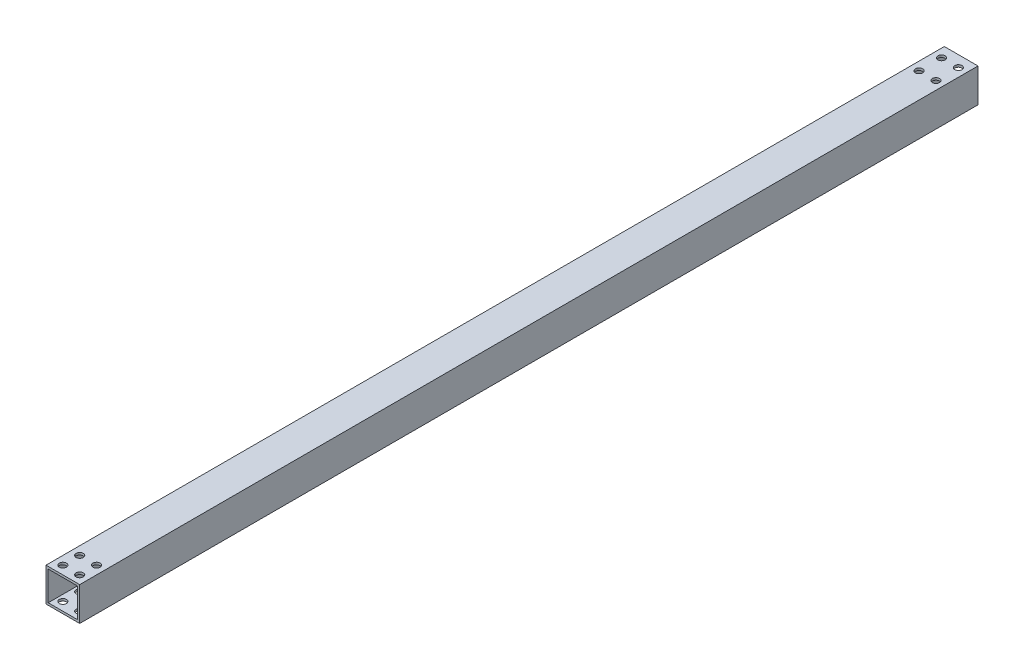
ISO-10303-21;
HEADER;
FILE_DESCRIPTION(('STEP AP214'),'2;1');
FILE_NAME('part.step','',(''),(''),'','','');
FILE_SCHEMA(('AUTOMOTIVE_DESIGN { 1 0 10303 214 1 1 1 1 }'));
ENDSEC;
DATA;
#1=APPLICATION_CONTEXT('core data for automotive mechanical design processes');
#2=APPLICATION_PROTOCOL_DEFINITION('international standard','automotive_design',2000,#1);
#3=PRODUCT_CONTEXT('',#1,'mechanical');
#4=PRODUCT('Part','Part','',(#3));
#5=PRODUCT_RELATED_PRODUCT_CATEGORY('part','',(#4));
#6=PRODUCT_DEFINITION_FORMATION('','',#4);
#7=PRODUCT_DEFINITION_CONTEXT('part definition',#1,'design');
#8=PRODUCT_DEFINITION('design','',#6,#7);
#9=PRODUCT_DEFINITION_SHAPE('','',#8);
#10=(LENGTH_UNIT() NAMED_UNIT(*) SI_UNIT(.MILLI.,.METRE.));
#11=(NAMED_UNIT(*) PLANE_ANGLE_UNIT() SI_UNIT($,.RADIAN.));
#12=(NAMED_UNIT(*) SI_UNIT($,.STERADIAN.) SOLID_ANGLE_UNIT());
#13=UNCERTAINTY_MEASURE_WITH_UNIT(LENGTH_MEASURE(1.E-05),#10,'distance_accuracy_value','');
#14=(GEOMETRIC_REPRESENTATION_CONTEXT(3) GLOBAL_UNCERTAINTY_ASSIGNED_CONTEXT((#13)) GLOBAL_UNIT_ASSIGNED_CONTEXT((#10,
#11,#12)) REPRESENTATION_CONTEXT('',''));
#15=CARTESIAN_POINT('',(0.,0.,0.));
#16=DIRECTION('',(0.,0.,1.));
#17=DIRECTION('',(1.,0.,0.));
#18=AXIS2_PLACEMENT_3D('',#15,#16,#17);
#19=CARTESIAN_POINT('',(0.,0.,400.));
#20=DIRECTION('',(0.,0.,1.));
#21=DIRECTION('',(1.,0.,0.));
#22=AXIS2_PLACEMENT_3D('',#19,#20,#21);
#23=PLANE('',#22);
#24=DIRECTION('',(0.,-1.,0.));
#25=VECTOR('',#24,1.);
#26=CARTESIAN_POINT('',(0.,0.,400.));
#27=LINE('',#26,#25);
#28=CARTESIAN_POINT('',(0.,0.,400.));
#29=VERTEX_POINT('',#28);
#30=CARTESIAN_POINT('',(0.,-15.,400.));
#31=VERTEX_POINT('',#30);
#32=EDGE_CURVE('E185',#29,#31,#27,.T.);
#33=ORIENTED_EDGE('',*,*,#32,.T.);
#34=DIRECTION('',(1.,0.,0.));
#35=VECTOR('',#34,1.);
#36=CARTESIAN_POINT('',(0.,-15.,400.));
#37=LINE('',#36,#35);
#38=CARTESIAN_POINT('',(15.,-15.,400.));
#39=VERTEX_POINT('',#38);
#40=EDGE_CURVE('E189',#31,#39,#37,.T.);
#41=ORIENTED_EDGE('',*,*,#40,.T.);
#42=DIRECTION('',(0.,1.,0.));
#43=VECTOR('',#42,1.);
#44=CARTESIAN_POINT('',(15.,0.,400.));
#45=LINE('',#44,#43);
#46=CARTESIAN_POINT('',(15.,0.,400.));
#47=VERTEX_POINT('',#46);
#48=EDGE_CURVE('E193',#39,#47,#45,.T.);
#49=ORIENTED_EDGE('',*,*,#48,.T.);
#50=DIRECTION('',(-1.,0.,0.));
#51=VECTOR('',#50,1.);
#52=CARTESIAN_POINT('',(0.,0.,400.));
#53=LINE('',#52,#51);
#54=EDGE_CURVE('E196',#47,#29,#53,.T.);
#55=ORIENTED_EDGE('',*,*,#54,.T.);
#56=EDGE_LOOP('',(#33,#41,#49,#55));
#57=FACE_BOUND('',#56,.T.);
#58=DIRECTION('',(1.,0.,0.));
#59=VECTOR('',#58,1.);
#60=CARTESIAN_POINT('',(0.,-14.,400.));
#61=LINE('',#60,#59);
#62=CARTESIAN_POINT('',(1.,-14.,400.));
#63=VERTEX_POINT('',#62);
#64=CARTESIAN_POINT('',(14.,-14.,400.));
#65=VERTEX_POINT('',#64);
#66=EDGE_CURVE('E144',#63,#65,#61,.T.);
#67=ORIENTED_EDGE('',*,*,#66,.F.);
#68=DIRECTION('',(0.,-1.,0.));
#69=VECTOR('',#68,1.);
#70=CARTESIAN_POINT('',(1.,0.,400.));
#71=LINE('',#70,#69);
#72=CARTESIAN_POINT('',(1.,-1.,400.));
#73=VERTEX_POINT('',#72);
#74=EDGE_CURVE('E135',#73,#63,#71,.T.);
#75=ORIENTED_EDGE('',*,*,#74,.F.);
#76=DIRECTION('',(-1.,0.,0.));
#77=VECTOR('',#76,1.);
#78=CARTESIAN_POINT('',(0.,-1.,400.));
#79=LINE('',#78,#77);
#80=CARTESIAN_POINT('',(14.,-1.,400.));
#81=VERTEX_POINT('',#80);
#82=EDGE_CURVE('E161',#81,#73,#79,.T.);
#83=ORIENTED_EDGE('',*,*,#82,.F.);
#84=DIRECTION('',(0.,1.,0.));
#85=VECTOR('',#84,1.);
#86=CARTESIAN_POINT('',(14.,0.,400.));
#87=LINE('',#86,#85);
#88=EDGE_CURVE('E157',#65,#81,#87,.T.);
#89=ORIENTED_EDGE('',*,*,#88,.F.);
#90=EDGE_LOOP('',(#67,#75,#83,#89));
#91=FACE_BOUND('',#90,.T.);
#92=ADVANCED_FACE('F67',(#57,#91),#23,.T.);
#93=CARTESIAN_POINT('',(0.,0.,0.));
#94=DIRECTION('',(0.,0.,1.));
#95=DIRECTION('',(1.,0.,0.));
#96=AXIS2_PLACEMENT_3D('',#93,#94,#95);
#97=PLANE('',#96);
#98=DIRECTION('',(0.,-1.,0.));
#99=VECTOR('',#98,1.);
#100=CARTESIAN_POINT('',(0.,0.,0.));
#101=LINE('',#100,#99);
#102=CARTESIAN_POINT('',(0.,0.,0.));
#103=VERTEX_POINT('',#102);
#104=CARTESIAN_POINT('',(0.,-15.,0.));
#105=VERTEX_POINT('',#104);
#106=EDGE_CURVE('E153',#103,#105,#101,.T.);
#107=ORIENTED_EDGE('',*,*,#106,.F.);
#108=DIRECTION('',(-1.,0.,0.));
#109=VECTOR('',#108,1.);
#110=CARTESIAN_POINT('',(0.,0.,0.));
#111=LINE('',#110,#109);
#112=CARTESIAN_POINT('',(15.,0.,0.));
#113=VERTEX_POINT('',#112);
#114=EDGE_CURVE('E190',#113,#103,#111,.T.);
#115=ORIENTED_EDGE('',*,*,#114,.F.);
#116=DIRECTION('',(0.,1.,0.));
#117=VECTOR('',#116,1.);
#118=CARTESIAN_POINT('',(15.,0.,0.));
#119=LINE('',#118,#117);
#120=CARTESIAN_POINT('',(15.,-15.,0.));
#121=VERTEX_POINT('',#120);
#122=EDGE_CURVE('E206',#121,#113,#119,.T.);
#123=ORIENTED_EDGE('',*,*,#122,.F.);
#124=DIRECTION('',(1.,0.,0.));
#125=VECTOR('',#124,1.);
#126=CARTESIAN_POINT('',(0.,-15.,0.));
#127=LINE('',#126,#125);
#128=EDGE_CURVE('E203',#105,#121,#127,.T.);
#129=ORIENTED_EDGE('',*,*,#128,.F.);
#130=EDGE_LOOP('',(#107,#115,#123,#129));
#131=FACE_BOUND('',#130,.T.);
#132=DIRECTION('',(0.,-1.,0.));
#133=VECTOR('',#132,1.);
#134=CARTESIAN_POINT('',(1.,0.,0.));
#135=LINE('',#134,#133);
#136=CARTESIAN_POINT('',(1.,-1.,0.));
#137=VERTEX_POINT('',#136);
#138=CARTESIAN_POINT('',(1.,-14.,0.));
#139=VERTEX_POINT('',#138);
#140=EDGE_CURVE('E93',#137,#139,#135,.T.);
#141=ORIENTED_EDGE('',*,*,#140,.T.);
#142=DIRECTION('',(1.,0.,0.));
#143=VECTOR('',#142,1.);
#144=CARTESIAN_POINT('',(0.,-14.,0.));
#145=LINE('',#144,#143);
#146=CARTESIAN_POINT('',(14.,-14.,0.));
#147=VERTEX_POINT('',#146);
#148=EDGE_CURVE('E151',#139,#147,#145,.T.);
#149=ORIENTED_EDGE('',*,*,#148,.T.);
#150=DIRECTION('',(0.,1.,0.));
#151=VECTOR('',#150,1.);
#152=CARTESIAN_POINT('',(14.,0.,0.));
#153=LINE('',#152,#151);
#154=CARTESIAN_POINT('',(14.,-1.,0.));
#155=VERTEX_POINT('',#154);
#156=EDGE_CURVE('E172',#147,#155,#153,.T.);
#157=ORIENTED_EDGE('',*,*,#156,.T.);
#158=DIRECTION('',(-1.,0.,0.));
#159=VECTOR('',#158,1.);
#160=CARTESIAN_POINT('',(0.,-1.,0.));
#161=LINE('',#160,#159);
#162=EDGE_CURVE('E145',#155,#137,#161,.T.);
#163=ORIENTED_EDGE('',*,*,#162,.T.);
#164=EDGE_LOOP('',(#141,#149,#157,#163));
#165=FACE_BOUND('',#164,.T.);
#166=ADVANCED_FACE('F298',(#131,#165),#97,.F.);
#167=CARTESIAN_POINT('',(0.,0.,400.));
#168=DIRECTION('',(1.,0.,0.));
#169=DIRECTION('',(0.,1.,0.));
#170=AXIS2_PLACEMENT_3D('',#167,#168,#169);
#171=PLANE('',#170);
#172=ORIENTED_EDGE('',*,*,#106,.T.);
#173=DIRECTION('',(0.,0.,-1.));
#174=VECTOR('',#173,1.);
#175=CARTESIAN_POINT('',(0.,-15.,400.));
#176=LINE('',#175,#174);
#177=EDGE_CURVE('E12',#31,#105,#176,.T.);
#178=ORIENTED_EDGE('',*,*,#177,.F.);
#179=ORIENTED_EDGE('',*,*,#32,.F.);
#180=DIRECTION('',(0.,0.,-1.));
#181=VECTOR('',#180,1.);
#182=CARTESIAN_POINT('',(0.,0.,400.));
#183=LINE('',#182,#181);
#184=EDGE_CURVE('E199',#29,#103,#183,.T.);
#185=ORIENTED_EDGE('',*,*,#184,.T.);
#186=EDGE_LOOP('',(#172,#178,#179,#185));
#187=FACE_BOUND('',#186,.T.);
#188=ADVANCED_FACE('F69',(#187),#171,.F.);
#189=CARTESIAN_POINT('',(0.,-15.,400.));
#190=DIRECTION('',(0.,1.,0.));
#191=DIRECTION('',(0.,0.,1.));
#192=AXIS2_PLACEMENT_3D('',#189,#190,#191);
#193=PLANE('',#192);
#194=CARTESIAN_POINT('',(11.25,-15.,5.));
#195=DIRECTION('',(0.,1.,0.));
#196=DIRECTION('',(0.,0.,-1.));
#197=AXIS2_PLACEMENT_3D('',#194,#195,#196);
#198=CIRCLE('',#197,1.6);
#199=CARTESIAN_POINT('',(11.25,-15.,3.4));
#200=VERTEX_POINT('',#199);
#201=EDGE_CURVE('E334',#200,#200,#198,.T.);
#202=ORIENTED_EDGE('',*,*,#201,.T.);
#203=EDGE_LOOP('',(#202));
#204=FACE_BOUND('',#203,.T.);
#205=CARTESIAN_POINT('',(11.25,-15.,15.));
#206=DIRECTION('',(0.,1.,0.));
#207=DIRECTION('',(0.,0.,1.));
#208=AXIS2_PLACEMENT_3D('',#205,#206,#207);
#209=CIRCLE('',#208,1.6);
#210=CARTESIAN_POINT('',(11.25,-15.,16.6));
#211=VERTEX_POINT('',#210);
#212=EDGE_CURVE('E338',#211,#211,#209,.T.);
#213=ORIENTED_EDGE('',*,*,#212,.T.);
#214=EDGE_LOOP('',(#213));
#215=FACE_BOUND('',#214,.T.);
#216=CARTESIAN_POINT('',(3.75,-15.,15.));
#217=DIRECTION('',(0.,1.,0.));
#218=DIRECTION('',(0.,0.,-1.));
#219=AXIS2_PLACEMENT_3D('',#216,#217,#218);
#220=CIRCLE('',#219,1.6);
#221=CARTESIAN_POINT('',(3.75,-15.,13.4));
#222=VERTEX_POINT('',#221);
#223=EDGE_CURVE('E342',#222,#222,#220,.T.);
#224=ORIENTED_EDGE('',*,*,#223,.T.);
#225=EDGE_LOOP('',(#224));
#226=FACE_BOUND('',#225,.T.);
#227=CARTESIAN_POINT('',(3.75000000000005,-15.,396.25));
#228=DIRECTION('',(0.,1.,0.));
#229=DIRECTION('',(0.,0.,1.));
#230=AXIS2_PLACEMENT_3D('',#227,#228,#229);
#231=CIRCLE('',#230,1.59999999999999);
#232=CARTESIAN_POINT('',(3.75000000000005,-15.,397.85));
#233=VERTEX_POINT('',#232);
#234=EDGE_CURVE('E346',#233,#233,#231,.T.);
#235=ORIENTED_EDGE('',*,*,#234,.T.);
#236=EDGE_LOOP('',(#235));
#237=FACE_BOUND('',#236,.T.);
#238=CARTESIAN_POINT('',(11.25,-15.,396.25));
#239=DIRECTION('',(0.,1.,0.));
#240=DIRECTION('',(0.,0.,-1.));
#241=AXIS2_PLACEMENT_3D('',#238,#239,#240);
#242=CIRCLE('',#241,1.59999999999999);
#243=CARTESIAN_POINT('',(11.25,-15.,394.65));
#244=VERTEX_POINT('',#243);
#245=EDGE_CURVE('E350',#244,#244,#242,.T.);
#246=ORIENTED_EDGE('',*,*,#245,.T.);
#247=EDGE_LOOP('',(#246));
#248=FACE_BOUND('',#247,.T.);
#249=CARTESIAN_POINT('',(11.25,-15.,388.75));
#250=DIRECTION('',(0.,1.,0.));
#251=DIRECTION('',(0.,0.,1.));
#252=AXIS2_PLACEMENT_3D('',#249,#250,#251);
#253=CIRCLE('',#252,1.59999999999999);
#254=CARTESIAN_POINT('',(11.25,-15.,390.35));
#255=VERTEX_POINT('',#254);
#256=EDGE_CURVE('E354',#255,#255,#253,.T.);
#257=ORIENTED_EDGE('',*,*,#256,.T.);
#258=EDGE_LOOP('',(#257));
#259=FACE_BOUND('',#258,.T.);
#260=CARTESIAN_POINT('',(3.75000000000005,-15.,388.75));
#261=DIRECTION('',(0.,1.,0.));
#262=DIRECTION('',(0.,0.,-1.));
#263=AXIS2_PLACEMENT_3D('',#260,#261,#262);
#264=CIRCLE('',#263,1.59999999999999);
#265=CARTESIAN_POINT('',(3.75000000000005,-15.,387.15));
#266=VERTEX_POINT('',#265);
#267=EDGE_CURVE('E358',#266,#266,#264,.T.);
#268=ORIENTED_EDGE('',*,*,#267,.T.);
#269=EDGE_LOOP('',(#268));
#270=FACE_BOUND('',#269,.T.);
#271=CARTESIAN_POINT('',(3.75,-15.,5.));
#272=DIRECTION('',(0.,1.,0.));
#273=DIRECTION('',(0.,0.,1.));
#274=AXIS2_PLACEMENT_3D('',#271,#272,#273);
#275=CIRCLE('',#274,1.6);
#276=CARTESIAN_POINT('',(3.75,-15.,6.6));
#277=VERTEX_POINT('',#276);
#278=EDGE_CURVE('E226',#277,#277,#275,.T.);
#279=ORIENTED_EDGE('',*,*,#278,.T.);
#280=EDGE_LOOP('',(#279));
#281=FACE_BOUND('',#280,.T.);
#282=ORIENTED_EDGE('',*,*,#128,.T.);
#283=DIRECTION('',(0.,0.,-1.));
#284=VECTOR('',#283,1.);
#285=CARTESIAN_POINT('',(15.,-15.,400.));
#286=LINE('',#285,#284);
#287=EDGE_CURVE('E77',#39,#121,#286,.T.);
#288=ORIENTED_EDGE('',*,*,#287,.F.);
#289=ORIENTED_EDGE('',*,*,#40,.F.);
#290=ORIENTED_EDGE('',*,*,#177,.T.);
#291=EDGE_LOOP('',(#282,#288,#289,#290));
#292=FACE_BOUND('',#291,.T.);
#293=ADVANCED_FACE('F323',(#204,#215,#226,#237,#248,#259,#270,#281,#292),#193,.F.);
#294=CARTESIAN_POINT('',(15.,0.,400.));
#295=DIRECTION('',(-1.,0.,0.));
#296=DIRECTION('',(0.,-1.,0.));
#297=AXIS2_PLACEMENT_3D('',#294,#295,#296);
#298=PLANE('',#297);
#299=ORIENTED_EDGE('',*,*,#122,.T.);
#300=DIRECTION('',(0.,0.,-1.));
#301=VECTOR('',#300,1.);
#302=CARTESIAN_POINT('',(15.,0.,400.));
#303=LINE('',#302,#301);
#304=EDGE_CURVE('E214',#47,#113,#303,.T.);
#305=ORIENTED_EDGE('',*,*,#304,.F.);
#306=ORIENTED_EDGE('',*,*,#48,.F.);
#307=ORIENTED_EDGE('',*,*,#287,.T.);
#308=EDGE_LOOP('',(#299,#305,#306,#307));
#309=FACE_BOUND('',#308,.T.);
#310=ADVANCED_FACE('F320',(#309),#298,.F.);
#311=CARTESIAN_POINT('',(0.,0.,400.));
#312=DIRECTION('',(0.,-1.,0.));
#313=DIRECTION('',(0.,0.,-1.));
#314=AXIS2_PLACEMENT_3D('',#311,#312,#313);
#315=PLANE('',#314);
#316=CARTESIAN_POINT('',(11.25,0.,5.));
#317=DIRECTION('',(0.,1.,0.));
#318=DIRECTION('',(0.,0.,-1.));
#319=AXIS2_PLACEMENT_3D('',#316,#317,#318);
#320=CIRCLE('',#319,1.6);
#321=CARTESIAN_POINT('',(11.25,0.,3.4));
#322=VERTEX_POINT('',#321);
#323=EDGE_CURVE('E379',#322,#322,#320,.T.);
#324=ORIENTED_EDGE('',*,*,#323,.F.);
#325=EDGE_LOOP('',(#324));
#326=FACE_BOUND('',#325,.T.);
#327=CARTESIAN_POINT('',(11.25,0.,15.));
#328=DIRECTION('',(0.,1.,0.));
#329=DIRECTION('',(0.,0.,1.));
#330=AXIS2_PLACEMENT_3D('',#327,#328,#329);
#331=CIRCLE('',#330,1.6);
#332=CARTESIAN_POINT('',(11.25,0.,16.6));
#333=VERTEX_POINT('',#332);
#334=EDGE_CURVE('E496',#333,#333,#331,.T.);
#335=ORIENTED_EDGE('',*,*,#334,.F.);
#336=EDGE_LOOP('',(#335));
#337=FACE_BOUND('',#336,.T.);
#338=CARTESIAN_POINT('',(3.75,0.,15.));
#339=DIRECTION('',(0.,1.,0.));
#340=DIRECTION('',(0.,0.,-1.));
#341=AXIS2_PLACEMENT_3D('',#338,#339,#340);
#342=CIRCLE('',#341,1.6);
#343=CARTESIAN_POINT('',(3.75,0.,13.4));
#344=VERTEX_POINT('',#343);
#345=EDGE_CURVE('E502',#344,#344,#342,.T.);
#346=ORIENTED_EDGE('',*,*,#345,.F.);
#347=EDGE_LOOP('',(#346));
#348=FACE_BOUND('',#347,.T.);
#349=CARTESIAN_POINT('',(3.75000000000005,0.,396.25));
#350=DIRECTION('',(0.,1.,0.));
#351=DIRECTION('',(0.,0.,1.));
#352=AXIS2_PLACEMENT_3D('',#349,#350,#351);
#353=CIRCLE('',#352,1.59999999999999);
#354=CARTESIAN_POINT('',(3.75000000000005,0.,397.85));
#355=VERTEX_POINT('',#354);
#356=EDGE_CURVE('E467',#355,#355,#353,.T.);
#357=ORIENTED_EDGE('',*,*,#356,.F.);
#358=EDGE_LOOP('',(#357));
#359=FACE_BOUND('',#358,.T.);
#360=CARTESIAN_POINT('',(11.25,0.,396.25));
#361=DIRECTION('',(0.,1.,0.));
#362=DIRECTION('',(0.,0.,-1.));
#363=AXIS2_PLACEMENT_3D('',#360,#361,#362);
#364=CIRCLE('',#363,1.59999999999999);
#365=CARTESIAN_POINT('',(11.25,0.,394.65));
#366=VERTEX_POINT('',#365);
#367=EDGE_CURVE('E468',#366,#366,#364,.T.);
#368=ORIENTED_EDGE('',*,*,#367,.F.);
#369=EDGE_LOOP('',(#368));
#370=FACE_BOUND('',#369,.T.);
#371=CARTESIAN_POINT('',(11.25,0.,388.75));
#372=DIRECTION('',(0.,1.,0.));
#373=DIRECTION('',(0.,0.,1.));
#374=AXIS2_PLACEMENT_3D('',#371,#372,#373);
#375=CIRCLE('',#374,1.59999999999999);
#376=CARTESIAN_POINT('',(11.25,0.,390.35));
#377=VERTEX_POINT('',#376);
#378=EDGE_CURVE('E477',#377,#377,#375,.T.);
#379=ORIENTED_EDGE('',*,*,#378,.F.);
#380=EDGE_LOOP('',(#379));
#381=FACE_BOUND('',#380,.T.);
#382=CARTESIAN_POINT('',(3.75000000000005,0.,388.75));
#383=DIRECTION('',(0.,1.,0.));
#384=DIRECTION('',(0.,0.,-1.));
#385=AXIS2_PLACEMENT_3D('',#382,#383,#384);
#386=CIRCLE('',#385,1.59999999999999);
#387=CARTESIAN_POINT('',(3.75000000000005,0.,387.15));
#388=VERTEX_POINT('',#387);
#389=EDGE_CURVE('E485',#388,#388,#386,.T.);
#390=ORIENTED_EDGE('',*,*,#389,.F.);
#391=EDGE_LOOP('',(#390));
#392=FACE_BOUND('',#391,.T.);
#393=CARTESIAN_POINT('',(3.75,0.,5.));
#394=DIRECTION('',(0.,1.,0.));
#395=DIRECTION('',(0.,0.,1.));
#396=AXIS2_PLACEMENT_3D('',#393,#394,#395);
#397=CIRCLE('',#396,1.6);
#398=CARTESIAN_POINT('',(3.75,0.,6.6));
#399=VERTEX_POINT('',#398);
#400=EDGE_CURVE('E375',#399,#399,#397,.T.);
#401=ORIENTED_EDGE('',*,*,#400,.F.);
#402=EDGE_LOOP('',(#401));
#403=FACE_BOUND('',#402,.T.);
#404=ORIENTED_EDGE('',*,*,#114,.T.);
#405=ORIENTED_EDGE('',*,*,#184,.F.);
#406=ORIENTED_EDGE('',*,*,#54,.F.);
#407=ORIENTED_EDGE('',*,*,#304,.T.);
#408=EDGE_LOOP('',(#404,#405,#406,#407));
#409=FACE_BOUND('',#408,.T.);
#410=ADVANCED_FACE('F317',(#326,#337,#348,#359,#370,#381,#392,#403,#409),#315,.F.);
#411=CARTESIAN_POINT('',(1.,0.,400.));
#412=DIRECTION('',(1.,0.,0.));
#413=DIRECTION('',(0.,1.,0.));
#414=AXIS2_PLACEMENT_3D('',#411,#412,#413);
#415=PLANE('',#414);
#416=ORIENTED_EDGE('',*,*,#140,.F.);
#417=DIRECTION('',(0.,0.,-1.));
#418=VECTOR('',#417,1.);
#419=CARTESIAN_POINT('',(1.,-1.,400.));
#420=LINE('',#419,#418);
#421=EDGE_CURVE('E139',#73,#137,#420,.T.);
#422=ORIENTED_EDGE('',*,*,#421,.F.);
#423=ORIENTED_EDGE('',*,*,#74,.T.);
#424=DIRECTION('',(0.,0.,-1.));
#425=VECTOR('',#424,1.);
#426=CARTESIAN_POINT('',(1.,-14.,400.));
#427=LINE('',#426,#425);
#428=EDGE_CURVE('E138',#63,#139,#427,.T.);
#429=ORIENTED_EDGE('',*,*,#428,.T.);
#430=EDGE_LOOP('',(#416,#422,#423,#429));
#431=FACE_BOUND('',#430,.T.);
#432=ADVANCED_FACE('F137',(#431),#415,.T.);
#433=CARTESIAN_POINT('',(0.,-14.,400.));
#434=DIRECTION('',(0.,1.,0.));
#435=DIRECTION('',(0.,0.,1.));
#436=AXIS2_PLACEMENT_3D('',#433,#434,#435);
#437=PLANE('',#436);
#438=CARTESIAN_POINT('',(11.25,-14.,5.));
#439=DIRECTION('',(0.,1.,0.));
#440=DIRECTION('',(0.,0.,1.));
#441=AXIS2_PLACEMENT_3D('',#438,#439,#440);
#442=CIRCLE('',#441,1.6);
#443=CARTESIAN_POINT('',(11.25,-14.,6.6));
#444=VERTEX_POINT('',#443);
#445=EDGE_CURVE('E169',#444,#444,#442,.T.);
#446=ORIENTED_EDGE('',*,*,#445,.F.);
#447=EDGE_LOOP('',(#446));
#448=FACE_BOUND('',#447,.T.);
#449=CARTESIAN_POINT('',(11.25,-14.,15.));
#450=DIRECTION('',(0.,1.,0.));
#451=DIRECTION('',(0.,0.,1.));
#452=AXIS2_PLACEMENT_3D('',#449,#450,#451);
#453=CIRCLE('',#452,1.6);
#454=CARTESIAN_POINT('',(11.25,-14.,16.6));
#455=VERTEX_POINT('',#454);
#456=EDGE_CURVE('E254',#455,#455,#453,.T.);
#457=ORIENTED_EDGE('',*,*,#456,.F.);
#458=EDGE_LOOP('',(#457));
#459=FACE_BOUND('',#458,.T.);
#460=CARTESIAN_POINT('',(3.75,-14.,15.));
#461=DIRECTION('',(0.,1.,0.));
#462=DIRECTION('',(0.,0.,1.));
#463=AXIS2_PLACEMENT_3D('',#460,#461,#462);
#464=CIRCLE('',#463,1.6);
#465=CARTESIAN_POINT('',(3.75,-14.,16.6));
#466=VERTEX_POINT('',#465);
#467=EDGE_CURVE('E250',#466,#466,#464,.T.);
#468=ORIENTED_EDGE('',*,*,#467,.F.);
#469=EDGE_LOOP('',(#468));
#470=FACE_BOUND('',#469,.T.);
#471=CARTESIAN_POINT('',(3.75000000000005,-14.,396.25));
#472=DIRECTION('',(0.,1.,0.));
#473=DIRECTION('',(0.,0.,1.));
#474=AXIS2_PLACEMENT_3D('',#471,#472,#473);
#475=CIRCLE('',#474,1.59999999999999);
#476=CARTESIAN_POINT('',(3.75000000000005,-14.,397.85));
#477=VERTEX_POINT('',#476);
#478=EDGE_CURVE('E246',#477,#477,#475,.T.);
#479=ORIENTED_EDGE('',*,*,#478,.F.);
#480=EDGE_LOOP('',(#479));
#481=FACE_BOUND('',#480,.T.);
#482=CARTESIAN_POINT('',(11.25,-14.,396.25));
#483=DIRECTION('',(0.,1.,0.));
#484=DIRECTION('',(0.,0.,1.));
#485=AXIS2_PLACEMENT_3D('',#482,#483,#484);
#486=CIRCLE('',#485,1.59999999999999);
#487=CARTESIAN_POINT('',(11.25,-14.,397.85));
#488=VERTEX_POINT('',#487);
#489=EDGE_CURVE('E241',#488,#488,#486,.T.);
#490=ORIENTED_EDGE('',*,*,#489,.F.);
#491=EDGE_LOOP('',(#490));
#492=FACE_BOUND('',#491,.T.);
#493=CARTESIAN_POINT('',(11.25,-14.,388.75));
#494=DIRECTION('',(0.,1.,0.));
#495=DIRECTION('',(0.,0.,1.));
#496=AXIS2_PLACEMENT_3D('',#493,#494,#495);
#497=CIRCLE('',#496,1.59999999999999);
#498=CARTESIAN_POINT('',(11.25,-14.,390.35));
#499=VERTEX_POINT('',#498);
#500=EDGE_CURVE('E236',#499,#499,#497,.T.);
#501=ORIENTED_EDGE('',*,*,#500,.F.);
#502=EDGE_LOOP('',(#501));
#503=FACE_BOUND('',#502,.T.);
#504=CARTESIAN_POINT('',(3.75000000000005,-14.,388.75));
#505=DIRECTION('',(0.,1.,0.));
#506=DIRECTION('',(0.,0.,1.));
#507=AXIS2_PLACEMENT_3D('',#504,#505,#506);
#508=CIRCLE('',#507,1.59999999999999);
#509=CARTESIAN_POINT('',(3.75000000000005,-14.,390.35));
#510=VERTEX_POINT('',#509);
#511=EDGE_CURVE('E231',#510,#510,#508,.T.);
#512=ORIENTED_EDGE('',*,*,#511,.F.);
#513=EDGE_LOOP('',(#512));
#514=FACE_BOUND('',#513,.T.);
#515=CARTESIAN_POINT('',(3.75,-14.,5.));
#516=DIRECTION('',(0.,1.,0.));
#517=DIRECTION('',(0.,0.,1.));
#518=AXIS2_PLACEMENT_3D('',#515,#516,#517);
#519=CIRCLE('',#518,1.6);
#520=CARTESIAN_POINT('',(3.75,-14.,6.6));
#521=VERTEX_POINT('',#520);
#522=EDGE_CURVE('E225',#521,#521,#519,.T.);
#523=ORIENTED_EDGE('',*,*,#522,.F.);
#524=EDGE_LOOP('',(#523));
#525=FACE_BOUND('',#524,.T.);
#526=ORIENTED_EDGE('',*,*,#148,.F.);
#527=ORIENTED_EDGE('',*,*,#428,.F.);
#528=ORIENTED_EDGE('',*,*,#66,.T.);
#529=DIRECTION('',(0.,0.,-1.));
#530=VECTOR('',#529,1.);
#531=CARTESIAN_POINT('',(14.,-14.,400.));
#532=LINE('',#531,#530);
#533=EDGE_CURVE('E154',#65,#147,#532,.T.);
#534=ORIENTED_EDGE('',*,*,#533,.T.);
#535=EDGE_LOOP('',(#526,#527,#528,#534));
#536=FACE_BOUND('',#535,.T.);
#537=ADVANCED_FACE('F148',(#448,#459,#470,#481,#492,#503,#514,#525,#536),#437,.T.);
#538=CARTESIAN_POINT('',(14.,0.,400.));
#539=DIRECTION('',(-1.,0.,0.));
#540=DIRECTION('',(0.,-1.,0.));
#541=AXIS2_PLACEMENT_3D('',#538,#539,#540);
#542=PLANE('',#541);
#543=ORIENTED_EDGE('',*,*,#156,.F.);
#544=ORIENTED_EDGE('',*,*,#533,.F.);
#545=ORIENTED_EDGE('',*,*,#88,.T.);
#546=DIRECTION('',(0.,0.,-1.));
#547=VECTOR('',#546,1.);
#548=CARTESIAN_POINT('',(14.,-1.,400.));
#549=LINE('',#548,#547);
#550=EDGE_CURVE('E85',#81,#155,#549,.T.);
#551=ORIENTED_EDGE('',*,*,#550,.T.);
#552=EDGE_LOOP('',(#543,#544,#545,#551));
#553=FACE_BOUND('',#552,.T.);
#554=ADVANCED_FACE('F282',(#553),#542,.T.);
#555=CARTESIAN_POINT('',(0.,-1.,400.));
#556=DIRECTION('',(0.,-1.,0.));
#557=DIRECTION('',(0.,0.,-1.));
#558=AXIS2_PLACEMENT_3D('',#555,#556,#557);
#559=PLANE('',#558);
#560=CARTESIAN_POINT('',(11.25,-1.,5.));
#561=DIRECTION('',(0.,-1.,0.));
#562=DIRECTION('',(0.,0.,-1.));
#563=AXIS2_PLACEMENT_3D('',#560,#561,#562);
#564=CIRCLE('',#563,1.6);
#565=CARTESIAN_POINT('',(11.25,-1.,3.4));
#566=VERTEX_POINT('',#565);
#567=EDGE_CURVE('E71',#566,#566,#564,.T.);
#568=ORIENTED_EDGE('',*,*,#567,.F.);
#569=EDGE_LOOP('',(#568));
#570=FACE_BOUND('',#569,.T.);
#571=CARTESIAN_POINT('',(11.25,-1.,15.));
#572=DIRECTION('',(0.,-1.,0.));
#573=DIRECTION('',(0.,0.,-1.));
#574=AXIS2_PLACEMENT_3D('',#571,#572,#573);
#575=CIRCLE('',#574,1.6);
#576=CARTESIAN_POINT('',(11.25,-1.,13.4));
#577=VERTEX_POINT('',#576);
#578=EDGE_CURVE('E251',#577,#577,#575,.T.);
#579=ORIENTED_EDGE('',*,*,#578,.F.);
#580=EDGE_LOOP('',(#579));
#581=FACE_BOUND('',#580,.T.);
#582=CARTESIAN_POINT('',(3.75,-1.,15.));
#583=DIRECTION('',(0.,-1.,0.));
#584=DIRECTION('',(0.,0.,-1.));
#585=AXIS2_PLACEMENT_3D('',#582,#583,#584);
#586=CIRCLE('',#585,1.6);
#587=CARTESIAN_POINT('',(3.75,-1.,13.4));
#588=VERTEX_POINT('',#587);
#589=EDGE_CURVE('E247',#588,#588,#586,.T.);
#590=ORIENTED_EDGE('',*,*,#589,.F.);
#591=EDGE_LOOP('',(#590));
#592=FACE_BOUND('',#591,.T.);
#593=CARTESIAN_POINT('',(3.75000000000005,-1.,396.25));
#594=DIRECTION('',(0.,-1.,0.));
#595=DIRECTION('',(0.,0.,-1.));
#596=AXIS2_PLACEMENT_3D('',#593,#594,#595);
#597=CIRCLE('',#596,1.59999999999999);
#598=CARTESIAN_POINT('',(3.75000000000005,-1.,394.65));
#599=VERTEX_POINT('',#598);
#600=EDGE_CURVE('E242',#599,#599,#597,.T.);
#601=ORIENTED_EDGE('',*,*,#600,.F.);
#602=EDGE_LOOP('',(#601));
#603=FACE_BOUND('',#602,.T.);
#604=CARTESIAN_POINT('',(11.25,-1.,396.25));
#605=DIRECTION('',(0.,-1.,0.));
#606=DIRECTION('',(0.,0.,-1.));
#607=AXIS2_PLACEMENT_3D('',#604,#605,#606);
#608=CIRCLE('',#607,1.59999999999999);
#609=CARTESIAN_POINT('',(11.25,-1.,394.65));
#610=VERTEX_POINT('',#609);
#611=EDGE_CURVE('E237',#610,#610,#608,.T.);
#612=ORIENTED_EDGE('',*,*,#611,.F.);
#613=EDGE_LOOP('',(#612));
#614=FACE_BOUND('',#613,.T.);
#615=CARTESIAN_POINT('',(11.25,-1.,388.75));
#616=DIRECTION('',(0.,-1.,0.));
#617=DIRECTION('',(0.,0.,-1.));
#618=AXIS2_PLACEMENT_3D('',#615,#616,#617);
#619=CIRCLE('',#618,1.59999999999999);
#620=CARTESIAN_POINT('',(11.25,-1.,387.15));
#621=VERTEX_POINT('',#620);
#622=EDGE_CURVE('E232',#621,#621,#619,.T.);
#623=ORIENTED_EDGE('',*,*,#622,.F.);
#624=EDGE_LOOP('',(#623));
#625=FACE_BOUND('',#624,.T.);
#626=CARTESIAN_POINT('',(3.75000000000005,-1.,388.75));
#627=DIRECTION('',(0.,-1.,0.));
#628=DIRECTION('',(0.,0.,-1.));
#629=AXIS2_PLACEMENT_3D('',#626,#627,#628);
#630=CIRCLE('',#629,1.59999999999999);
#631=CARTESIAN_POINT('',(3.75000000000005,-1.,387.15));
#632=VERTEX_POINT('',#631);
#633=EDGE_CURVE('E227',#632,#632,#630,.T.);
#634=ORIENTED_EDGE('',*,*,#633,.F.);
#635=EDGE_LOOP('',(#634));
#636=FACE_BOUND('',#635,.T.);
#637=CARTESIAN_POINT('',(3.75,-1.,5.));
#638=DIRECTION('',(0.,-1.,0.));
#639=DIRECTION('',(0.,0.,-1.));
#640=AXIS2_PLACEMENT_3D('',#637,#638,#639);
#641=CIRCLE('',#640,1.6);
#642=CARTESIAN_POINT('',(3.75,-1.,3.4));
#643=VERTEX_POINT('',#642);
#644=EDGE_CURVE('E221',#643,#643,#641,.T.);
#645=ORIENTED_EDGE('',*,*,#644,.F.);
#646=EDGE_LOOP('',(#645));
#647=FACE_BOUND('',#646,.T.);
#648=ORIENTED_EDGE('',*,*,#162,.F.);
#649=ORIENTED_EDGE('',*,*,#550,.F.);
#650=ORIENTED_EDGE('',*,*,#82,.T.);
#651=ORIENTED_EDGE('',*,*,#421,.T.);
#652=EDGE_LOOP('',(#648,#649,#650,#651));
#653=FACE_BOUND('',#652,.T.);
#654=ADVANCED_FACE('F278',(#570,#581,#592,#603,#614,#625,#636,#647,#653),#559,.T.);
#655=CARTESIAN_POINT('',(3.75,-15.,5.));
#656=DIRECTION('',(0.,1.,0.));
#657=DIRECTION('',(0.,0.,1.));
#658=AXIS2_PLACEMENT_3D('',#655,#656,#657);
#659=CYLINDRICAL_SURFACE('',#658,1.6);
#660=ORIENTED_EDGE('',*,*,#644,.T.);
#661=EDGE_LOOP('',(#660));
#662=FACE_BOUND('',#661,.T.);
#663=ORIENTED_EDGE('',*,*,#400,.T.);
#664=EDGE_LOOP('',(#663));
#665=FACE_BOUND('',#664,.T.);
#666=ADVANCED_FACE('F281',(#662,#665),#659,.F.);
#667=CARTESIAN_POINT('',(3.75000000000005,-15.,388.75));
#668=DIRECTION('',(0.,1.,0.));
#669=DIRECTION('',(0.,0.,1.));
#670=AXIS2_PLACEMENT_3D('',#667,#668,#669);
#671=CYLINDRICAL_SURFACE('',#670,1.59999999999999);
#672=ORIENTED_EDGE('',*,*,#633,.T.);
#673=EDGE_LOOP('',(#672));
#674=FACE_BOUND('',#673,.T.);
#675=ORIENTED_EDGE('',*,*,#389,.T.);
#676=EDGE_LOOP('',(#675));
#677=FACE_BOUND('',#676,.T.);
#678=ADVANCED_FACE('F417',(#674,#677),#671,.F.);
#679=CARTESIAN_POINT('',(11.25,-15.,388.75));
#680=DIRECTION('',(0.,1.,0.));
#681=DIRECTION('',(0.,0.,1.));
#682=AXIS2_PLACEMENT_3D('',#679,#680,#681);
#683=CYLINDRICAL_SURFACE('',#682,1.59999999999999);
#684=ORIENTED_EDGE('',*,*,#622,.T.);
#685=EDGE_LOOP('',(#684));
#686=FACE_BOUND('',#685,.T.);
#687=ORIENTED_EDGE('',*,*,#378,.T.);
#688=EDGE_LOOP('',(#687));
#689=FACE_BOUND('',#688,.T.);
#690=ADVANCED_FACE('F427',(#686,#689),#683,.F.);
#691=CARTESIAN_POINT('',(11.25,-15.,396.25));
#692=DIRECTION('',(0.,1.,0.));
#693=DIRECTION('',(0.,0.,1.));
#694=AXIS2_PLACEMENT_3D('',#691,#692,#693);
#695=CYLINDRICAL_SURFACE('',#694,1.59999999999999);
#696=ORIENTED_EDGE('',*,*,#611,.T.);
#697=EDGE_LOOP('',(#696));
#698=FACE_BOUND('',#697,.T.);
#699=ORIENTED_EDGE('',*,*,#367,.T.);
#700=EDGE_LOOP('',(#699));
#701=FACE_BOUND('',#700,.T.);
#702=ADVANCED_FACE('F435',(#698,#701),#695,.F.);
#703=CARTESIAN_POINT('',(3.75000000000005,-15.,396.25));
#704=DIRECTION('',(0.,1.,0.));
#705=DIRECTION('',(0.,0.,1.));
#706=AXIS2_PLACEMENT_3D('',#703,#704,#705);
#707=CYLINDRICAL_SURFACE('',#706,1.59999999999999);
#708=ORIENTED_EDGE('',*,*,#600,.T.);
#709=EDGE_LOOP('',(#708));
#710=FACE_BOUND('',#709,.T.);
#711=ORIENTED_EDGE('',*,*,#356,.T.);
#712=EDGE_LOOP('',(#711));
#713=FACE_BOUND('',#712,.T.);
#714=ADVANCED_FACE('F446',(#710,#713),#707,.F.);
#715=CARTESIAN_POINT('',(3.75,-15.,15.));
#716=DIRECTION('',(0.,1.,0.));
#717=DIRECTION('',(0.,0.,1.));
#718=AXIS2_PLACEMENT_3D('',#715,#716,#717);
#719=CYLINDRICAL_SURFACE('',#718,1.6);
#720=ORIENTED_EDGE('',*,*,#589,.T.);
#721=EDGE_LOOP('',(#720));
#722=FACE_BOUND('',#721,.T.);
#723=ORIENTED_EDGE('',*,*,#345,.T.);
#724=EDGE_LOOP('',(#723));
#725=FACE_BOUND('',#724,.T.);
#726=ADVANCED_FACE('F443',(#722,#725),#719,.F.);
#727=CARTESIAN_POINT('',(11.25,-15.,15.));
#728=DIRECTION('',(0.,1.,0.));
#729=DIRECTION('',(0.,0.,1.));
#730=AXIS2_PLACEMENT_3D('',#727,#728,#729);
#731=CYLINDRICAL_SURFACE('',#730,1.6);
#732=ORIENTED_EDGE('',*,*,#578,.T.);
#733=EDGE_LOOP('',(#732));
#734=FACE_BOUND('',#733,.T.);
#735=ORIENTED_EDGE('',*,*,#334,.T.);
#736=EDGE_LOOP('',(#735));
#737=FACE_BOUND('',#736,.T.);
#738=ADVANCED_FACE('F418',(#734,#737),#731,.F.);
#739=CARTESIAN_POINT('',(11.25,-15.,5.));
#740=DIRECTION('',(0.,1.,0.));
#741=DIRECTION('',(0.,0.,1.));
#742=AXIS2_PLACEMENT_3D('',#739,#740,#741);
#743=CYLINDRICAL_SURFACE('',#742,1.6);
#744=ORIENTED_EDGE('',*,*,#567,.T.);
#745=EDGE_LOOP('',(#744));
#746=FACE_BOUND('',#745,.T.);
#747=ORIENTED_EDGE('',*,*,#323,.T.);
#748=EDGE_LOOP('',(#747));
#749=FACE_BOUND('',#748,.T.);
#750=ADVANCED_FACE('F275',(#746,#749),#743,.F.);
#751=ORIENTED_EDGE('',*,*,#522,.T.);
#752=EDGE_LOOP('',(#751));
#753=FACE_BOUND('',#752,.T.);
#754=ORIENTED_EDGE('',*,*,#278,.F.);
#755=EDGE_LOOP('',(#754));
#756=FACE_BOUND('',#755,.T.);
#757=ADVANCED_FACE('F406',(#753,#756),#659,.F.);
#758=ORIENTED_EDGE('',*,*,#511,.T.);
#759=EDGE_LOOP('',(#758));
#760=FACE_BOUND('',#759,.T.);
#761=ORIENTED_EDGE('',*,*,#267,.F.);
#762=EDGE_LOOP('',(#761));
#763=FACE_BOUND('',#762,.T.);
#764=ADVANCED_FACE('F408',(#760,#763),#671,.F.);
#765=ORIENTED_EDGE('',*,*,#500,.T.);
#766=EDGE_LOOP('',(#765));
#767=FACE_BOUND('',#766,.T.);
#768=ORIENTED_EDGE('',*,*,#256,.F.);
#769=EDGE_LOOP('',(#768));
#770=FACE_BOUND('',#769,.T.);
#771=ADVANCED_FACE('F414',(#767,#770),#683,.F.);
#772=ORIENTED_EDGE('',*,*,#489,.T.);
#773=EDGE_LOOP('',(#772));
#774=FACE_BOUND('',#773,.T.);
#775=ORIENTED_EDGE('',*,*,#245,.F.);
#776=EDGE_LOOP('',(#775));
#777=FACE_BOUND('',#776,.T.);
#778=ADVANCED_FACE('F396',(#774,#777),#695,.F.);
#779=ORIENTED_EDGE('',*,*,#478,.T.);
#780=EDGE_LOOP('',(#779));
#781=FACE_BOUND('',#780,.T.);
#782=ORIENTED_EDGE('',*,*,#234,.F.);
#783=EDGE_LOOP('',(#782));
#784=FACE_BOUND('',#783,.T.);
#785=ADVANCED_FACE('F451',(#781,#784),#707,.F.);
#786=ORIENTED_EDGE('',*,*,#467,.T.);
#787=EDGE_LOOP('',(#786));
#788=FACE_BOUND('',#787,.T.);
#789=ORIENTED_EDGE('',*,*,#223,.F.);
#790=EDGE_LOOP('',(#789));
#791=FACE_BOUND('',#790,.T.);
#792=ADVANCED_FACE('F448',(#788,#791),#719,.F.);
#793=ORIENTED_EDGE('',*,*,#456,.T.);
#794=EDGE_LOOP('',(#793));
#795=FACE_BOUND('',#794,.T.);
#796=ORIENTED_EDGE('',*,*,#212,.F.);
#797=EDGE_LOOP('',(#796));
#798=FACE_BOUND('',#797,.T.);
#799=ADVANCED_FACE('F444',(#795,#798),#731,.F.);
#800=ORIENTED_EDGE('',*,*,#445,.T.);
#801=EDGE_LOOP('',(#800));
#802=FACE_BOUND('',#801,.T.);
#803=ORIENTED_EDGE('',*,*,#201,.F.);
#804=EDGE_LOOP('',(#803));
#805=FACE_BOUND('',#804,.T.);
#806=ADVANCED_FACE('F420',(#802,#805),#743,.F.);
#807=CLOSED_SHELL('',(#92,#166,#188,#293,#310,#410,#432,#537,#554,#654,#666,#678,#690,#702,#714,
#726,#738,#750,#757,#764,#771,#778,#785,#792,#799,#806));
#808=MANIFOLD_SOLID_BREP('B2',#807);
#809=ADVANCED_BREP_SHAPE_REPRESENTATION('',(#18,#808),#14);
#810=SHAPE_DEFINITION_REPRESENTATION(#9,#809);
ENDSEC;
END-ISO-10303-21;
